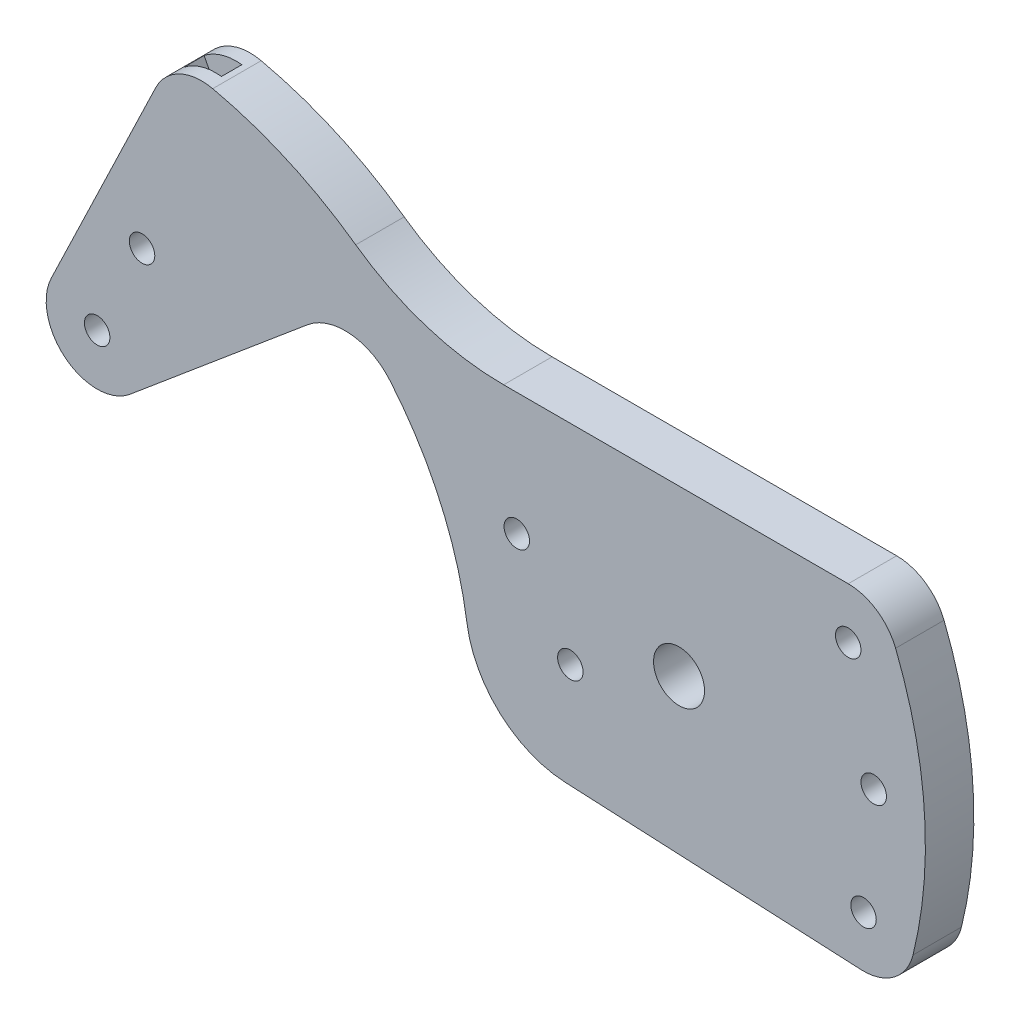
ISO-10303-21;
HEADER;
FILE_DESCRIPTION(('STEP AP214'),'2;1');
FILE_NAME('part.step','',(''),(''),'','','');
FILE_SCHEMA(('AUTOMOTIVE_DESIGN { 1 0 10303 214 1 1 1 1 }'));
ENDSEC;
DATA;
#1=APPLICATION_CONTEXT('core data for automotive mechanical design processes');
#2=APPLICATION_PROTOCOL_DEFINITION('international standard','automotive_design',2000,#1);
#3=PRODUCT_CONTEXT('',#1,'mechanical');
#4=PRODUCT('Part','Part','',(#3));
#5=PRODUCT_RELATED_PRODUCT_CATEGORY('part','',(#4));
#6=PRODUCT_DEFINITION_FORMATION('','',#4);
#7=PRODUCT_DEFINITION_CONTEXT('part definition',#1,'design');
#8=PRODUCT_DEFINITION('design','',#6,#7);
#9=PRODUCT_DEFINITION_SHAPE('','',#8);
#10=(LENGTH_UNIT() NAMED_UNIT(*) SI_UNIT(.MILLI.,.METRE.));
#11=(NAMED_UNIT(*) PLANE_ANGLE_UNIT() SI_UNIT($,.RADIAN.));
#12=(NAMED_UNIT(*) SI_UNIT($,.STERADIAN.) SOLID_ANGLE_UNIT());
#13=UNCERTAINTY_MEASURE_WITH_UNIT(LENGTH_MEASURE(1.E-05),#10,'distance_accuracy_value','');
#14=(GEOMETRIC_REPRESENTATION_CONTEXT(3) GLOBAL_UNCERTAINTY_ASSIGNED_CONTEXT((#13)) GLOBAL_UNIT_ASSIGNED_CONTEXT((#10,
#11,#12)) REPRESENTATION_CONTEXT('',''));
#15=CARTESIAN_POINT('',(0.,0.,0.));
#16=DIRECTION('',(0.,0.,1.));
#17=DIRECTION('',(1.,0.,0.));
#18=AXIS2_PLACEMENT_3D('',#15,#16,#17);
#19=CARTESIAN_POINT('',(-93.6271419122202,44.3112180216615,4.75));
#20=DIRECTION('',(0.,0.,-1.));
#21=DIRECTION('',(-1.,0.,0.));
#22=AXIS2_PLACEMENT_3D('',#19,#20,#21);
#23=CYLINDRICAL_SURFACE('',#22,9.99999999999999);
#24=CARTESIAN_POINT('',(-93.6271419122202,44.3112180216615,-4.75));
#25=DIRECTION('',(0.,0.,1.));
#26=DIRECTION('',(1.,0.,0.));
#27=AXIS2_PLACEMENT_3D('',#24,#25,#26);
#28=CIRCLE('',#27,9.99999999999999);
#29=CARTESIAN_POINT('',(-91.4485216964092,54.0710138164135,-4.75));
#30=VERTEX_POINT('',#29);
#31=CARTESIAN_POINT('',(-102.639296293273,48.6449316038071,-4.75));
#32=VERTEX_POINT('',#31);
#33=EDGE_CURVE('E289',#30,#32,#28,.T.);
#34=ORIENTED_EDGE('',*,*,#33,.T.);
#35=DIRECTION('',(0.,0.,-1.));
#36=VECTOR('',#35,1.);
#37=CARTESIAN_POINT('',(-102.639296293273,48.6449316038071,4.75));
#38=LINE('',#37,#36);
#39=CARTESIAN_POINT('',(-102.639296293273,48.6449316038071,4.75));
#40=VERTEX_POINT('',#39);
#41=EDGE_CURVE('E369',#40,#32,#38,.T.);
#42=ORIENTED_EDGE('',*,*,#41,.F.);
#43=CARTESIAN_POINT('',(-93.6271419122202,44.3112180216615,4.75));
#44=DIRECTION('',(0.,0.,1.));
#45=DIRECTION('',(1.,0.,0.));
#46=AXIS2_PLACEMENT_3D('',#43,#44,#45);
#47=CIRCLE('',#46,9.99999999999999);
#48=CARTESIAN_POINT('',(-91.4485216964092,54.0710138164135,4.75));
#49=VERTEX_POINT('',#48);
#50=EDGE_CURVE('E231',#49,#40,#47,.T.);
#51=ORIENTED_EDGE('',*,*,#50,.F.);
#52=DIRECTION('',(0.,0.,-1.));
#53=VECTOR('',#52,1.);
#54=CARTESIAN_POINT('',(-91.4485216964092,54.0710138164135,4.75));
#55=LINE('',#54,#53);
#56=EDGE_CURVE('E43',#49,#30,#55,.T.);
#57=ORIENTED_EDGE('',*,*,#56,.T.);
#58=EDGE_LOOP('',(#34,#42,#51,#57));
#59=FACE_BOUND('',#58,.T.);
#60=CARTESIAN_POINT('',(-93.6271419122202,44.3112180216615,-2.));
#61=DIRECTION('',(0.,0.,1.));
#62=DIRECTION('',(1.,0.,0.));
#63=AXIS2_PLACEMENT_3D('',#60,#61,#62);
#64=CIRCLE('',#63,10.);
#65=CARTESIAN_POINT('',(-92.4866613894352,54.2459703677016,-2.));
#66=VERTEX_POINT('',#65);
#67=CARTESIAN_POINT('',(-99.8894273287539,52.1076134299171,-2.));
#68=VERTEX_POINT('',#67);
#69=EDGE_CURVE('E189',#66,#68,#64,.T.);
#70=ORIENTED_EDGE('',*,*,#69,.F.);
#71=DIRECTION('',(0.,0.,1.));
#72=VECTOR('',#71,1.);
#73=CARTESIAN_POINT('',(-92.4866613894352,54.2459703677016,-2.));
#74=LINE('',#73,#72);
#75=CARTESIAN_POINT('',(-92.4866613894352,54.2459703677016,2.));
#76=VERTEX_POINT('',#75);
#77=EDGE_CURVE('E172',#66,#76,#74,.T.);
#78=ORIENTED_EDGE('',*,*,#77,.T.);
#79=CARTESIAN_POINT('',(-93.6271419122202,44.3112180216615,2.));
#80=DIRECTION('',(0.,0.,1.));
#81=DIRECTION('',(1.,0.,0.));
#82=AXIS2_PLACEMENT_3D('',#79,#80,#81);
#83=CIRCLE('',#82,10.);
#84=CARTESIAN_POINT('',(-99.8894273287539,52.1076134299171,2.));
#85=VERTEX_POINT('',#84);
#86=EDGE_CURVE('E204',#76,#85,#83,.T.);
#87=ORIENTED_EDGE('',*,*,#86,.T.);
#88=DIRECTION('',(0.,0.,1.));
#89=VECTOR('',#88,1.);
#90=CARTESIAN_POINT('',(-99.8894273287539,52.1076134299171,-2.));
#91=LINE('',#90,#89);
#92=EDGE_CURVE('E182',#68,#85,#91,.T.);
#93=ORIENTED_EDGE('',*,*,#92,.F.);
#94=EDGE_LOOP('',(#70,#78,#87,#93));
#95=FACE_BOUND('',#94,.T.);
#96=ADVANCED_FACE('F35',(#59,#95),#23,.T.);
#97=CARTESIAN_POINT('',(-41.5599291638824,49.5291948890183,4.75));
#98=DIRECTION('',(-0.642787609686535,0.766044443118982,0.));
#99=DIRECTION('',(-0.766044443118982,-0.642787609686535,0.));
#100=AXIS2_PLACEMENT_3D('',#97,#98,#99);
#101=PLANE('',#100);
#102=DIRECTION('',(0.766044443118982,0.642787609686535,0.));
#103=VECTOR('',#102,1.);
#104=CARTESIAN_POINT('',(-41.5599291638824,49.5291948890183,-4.75));
#105=LINE('',#104,#103);
#106=CARTESIAN_POINT('',(-107.689906175498,-5.96044443118984,-4.75));
#107=VERTEX_POINT('',#106);
#108=CARTESIAN_POINT('',(-72.8648183450266,23.2612739230748,-4.75));
#109=VERTEX_POINT('',#108);
#110=EDGE_CURVE('E297',#107,#109,#105,.T.);
#111=ORIENTED_EDGE('',*,*,#110,.T.);
#112=DIRECTION('',(0.,0.,-1.));
#113=VECTOR('',#112,1.);
#114=CARTESIAN_POINT('',(-72.8648183450266,23.2612739230748,4.75));
#115=LINE('',#114,#113);
#116=CARTESIAN_POINT('',(-72.8648183450266,23.2612739230748,4.75));
#117=VERTEX_POINT('',#116);
#118=EDGE_CURVE('E362',#117,#109,#115,.T.);
#119=ORIENTED_EDGE('',*,*,#118,.F.);
#120=DIRECTION('',(0.766044443118982,0.642787609686535,0.));
#121=VECTOR('',#120,1.);
#122=CARTESIAN_POINT('',(-41.5599291638824,49.5291948890183,4.75));
#123=LINE('',#122,#121);
#124=CARTESIAN_POINT('',(-107.689906175498,-5.96044443118984,4.75));
#125=VERTEX_POINT('',#124);
#126=EDGE_CURVE('E238',#125,#117,#123,.T.);
#127=ORIENTED_EDGE('',*,*,#126,.F.);
#128=DIRECTION('',(0.,0.,-1.));
#129=VECTOR('',#128,1.);
#130=CARTESIAN_POINT('',(-107.689906175498,-5.96044443118984,4.75));
#131=LINE('',#130,#129);
#132=EDGE_CURVE('E364',#125,#107,#131,.T.);
#133=ORIENTED_EDGE('',*,*,#132,.T.);
#134=EDGE_LOOP('',(#111,#119,#127,#133));
#135=FACE_BOUND('',#134,.T.);
#136=DIRECTION('',(0.766044443118982,0.642787609686534,0.));
#137=VECTOR('',#136,1.);
#138=CARTESIAN_POINT('',(-41.5599291638823,49.5291948890183,-2.));
#139=LINE('',#138,#137);
#140=CARTESIAN_POINT('',(-92.3690173131185,6.89530776254084,-2.));
#141=VERTEX_POINT('',#140);
#142=CARTESIAN_POINT('',(-78.2271294468595,18.7617606552691,-2.));
#143=VERTEX_POINT('',#142);
#144=EDGE_CURVE('E200',#141,#143,#139,.T.);
#145=ORIENTED_EDGE('',*,*,#144,.F.);
#146=DIRECTION('',(0.,0.,1.));
#147=VECTOR('',#146,1.);
#148=CARTESIAN_POINT('',(-92.3690173131185,6.89530776254084,-2.));
#149=LINE('',#148,#147);
#150=CARTESIAN_POINT('',(-92.3690173131185,6.89530776254084,2.));
#151=VERTEX_POINT('',#150);
#152=EDGE_CURVE('E219',#141,#151,#149,.T.);
#153=ORIENTED_EDGE('',*,*,#152,.T.);
#154=DIRECTION('',(0.766044443118982,0.642787609686534,0.));
#155=VECTOR('',#154,1.);
#156=CARTESIAN_POINT('',(-41.5599291638823,49.5291948890183,2.));
#157=LINE('',#156,#155);
#158=CARTESIAN_POINT('',(-78.2271294468595,18.7617606552691,2.));
#159=VERTEX_POINT('',#158);
#160=EDGE_CURVE('E210',#151,#159,#157,.T.);
#161=ORIENTED_EDGE('',*,*,#160,.T.);
#162=DIRECTION('',(0.,0.,1.));
#163=VECTOR('',#162,1.);
#164=CARTESIAN_POINT('',(-78.2271294468595,18.7617606552691,-2.));
#165=LINE('',#164,#163);
#166=EDGE_CURVE('E217',#143,#159,#165,.T.);
#167=ORIENTED_EDGE('',*,*,#166,.F.);
#168=EDGE_LOOP('',(#145,#153,#161,#167));
#169=FACE_BOUND('',#168,.T.);
#170=ADVANCED_FACE('F434',(#135,#169),#101,.F.);
#171=CARTESIAN_POINT('',(-34.3975290849493,82.3,4.75));
#172=DIRECTION('',(0.,0.,-1.));
#173=DIRECTION('',(-1.,0.,0.));
#174=AXIS2_PLACEMENT_3D('',#171,#172,#173);
#175=CYLINDRICAL_SURFACE('',#174,50.);
#176=CARTESIAN_POINT('',(-34.3975290849493,82.3,-4.75));
#177=DIRECTION('',(0.,0.,1.));
#178=DIRECTION('',(1.,0.,0.));
#179=AXIS2_PLACEMENT_3D('',#176,#177,#178);
#180=CIRCLE('',#179,50.);
#181=CARTESIAN_POINT('',(-63.4015741934302,41.572056676709,-4.75));
#182=VERTEX_POINT('',#181);
#183=CARTESIAN_POINT('',(-34.3975290849493,32.3,-4.75));
#184=VERTEX_POINT('',#183);
#185=EDGE_CURVE('E216',#182,#184,#180,.T.);
#186=ORIENTED_EDGE('',*,*,#185,.F.);
#187=DIRECTION('',(0.,0.,-1.));
#188=VECTOR('',#187,1.);
#189=CARTESIAN_POINT('',(-63.4015741934302,41.572056676709,4.75));
#190=LINE('',#189,#188);
#191=CARTESIAN_POINT('',(-63.4015741934302,41.572056676709,4.75));
#192=VERTEX_POINT('',#191);
#193=EDGE_CURVE('E11',#192,#182,#190,.T.);
#194=ORIENTED_EDGE('',*,*,#193,.F.);
#195=CARTESIAN_POINT('',(-34.3975290849493,82.3,4.75));
#196=DIRECTION('',(0.,0.,1.));
#197=DIRECTION('',(1.,0.,0.));
#198=AXIS2_PLACEMENT_3D('',#195,#196,#197);
#199=CIRCLE('',#198,50.);
#200=CARTESIAN_POINT('',(-34.3975290849493,32.3,4.75));
#201=VERTEX_POINT('',#200);
#202=EDGE_CURVE('E225',#192,#201,#199,.T.);
#203=ORIENTED_EDGE('',*,*,#202,.T.);
#204=DIRECTION('',(0.,0.,-1.));
#205=VECTOR('',#204,1.);
#206=CARTESIAN_POINT('',(-34.3975290849493,32.3,4.75));
#207=LINE('',#206,#205);
#208=EDGE_CURVE('E284',#201,#184,#207,.T.);
#209=ORIENTED_EDGE('',*,*,#208,.T.);
#210=EDGE_LOOP('',(#186,#194,#203,#209));
#211=FACE_BOUND('',#210,.T.);
#212=ADVANCED_FACE('F37',(#211),#175,.F.);
#213=CARTESIAN_POINT('',(-108.317782272363,-21.5,4.75));
#214=DIRECTION('',(0.,0.,-1.));
#215=DIRECTION('',(-1.,0.,0.));
#216=AXIS2_PLACEMENT_3D('',#213,#214,#215);
#217=CYLINDRICAL_SURFACE('',#216,77.4309374967139);
#218=CARTESIAN_POINT('',(-108.317782272363,-21.5,-4.75));
#219=DIRECTION('',(0.,0.,1.));
#220=DIRECTION('',(1.,0.,0.));
#221=AXIS2_PLACEMENT_3D('',#218,#219,#220);
#222=CIRCLE('',#221,77.4309374967139);
#223=EDGE_CURVE('E287',#182,#30,#222,.T.);
#224=ORIENTED_EDGE('',*,*,#223,.T.);
#225=ORIENTED_EDGE('',*,*,#56,.F.);
#226=CARTESIAN_POINT('',(-108.317782272363,-21.5,4.75));
#227=DIRECTION('',(0.,0.,1.));
#228=DIRECTION('',(1.,0.,0.));
#229=AXIS2_PLACEMENT_3D('',#226,#227,#228);
#230=CIRCLE('',#229,77.4309374967139);
#231=EDGE_CURVE('E228',#192,#49,#230,.T.);
#232=ORIENTED_EDGE('',*,*,#231,.F.);
#233=ORIENTED_EDGE('',*,*,#193,.T.);
#234=EDGE_LOOP('',(#224,#225,#232,#233));
#235=FACE_BOUND('',#234,.T.);
#236=ADVANCED_FACE('F396',(#235),#217,.T.);
#237=CARTESIAN_POINT('',(-102.361345817989,49.2229422512733,4.75));
#238=DIRECTION('',(-0.901215438105268,0.433371358214556,0.));
#239=DIRECTION('',(-0.433371358214556,-0.901215438105268,0.));
#240=AXIS2_PLACEMENT_3D('',#237,#238,#239);
#241=PLANE('',#240);
#242=DIRECTION('',(0.433371358214557,0.901215438105268,0.));
#243=VECTOR('',#242,1.);
#244=CARTESIAN_POINT('',(-102.361345817989,49.2229422512733,-4.75));
#245=LINE('',#244,#243);
#246=CARTESIAN_POINT('',(-123.129936653416,6.03371358214555,-4.75));
#247=VERTEX_POINT('',#246);
#248=EDGE_CURVE('E292',#247,#32,#245,.T.);
#249=ORIENTED_EDGE('',*,*,#248,.F.);
#250=DIRECTION('',(0.,0.,-1.));
#251=VECTOR('',#250,1.);
#252=CARTESIAN_POINT('',(-123.129936653416,6.03371358214555,4.75));
#253=LINE('',#252,#251);
#254=CARTESIAN_POINT('',(-123.129936653416,6.03371358214555,4.75));
#255=VERTEX_POINT('',#254);
#256=EDGE_CURVE('E367',#255,#247,#253,.T.);
#257=ORIENTED_EDGE('',*,*,#256,.F.);
#258=DIRECTION('',(0.433371358214557,0.901215438105268,0.));
#259=VECTOR('',#258,1.);
#260=CARTESIAN_POINT('',(-102.361345817989,49.2229422512733,4.75));
#261=LINE('',#260,#259);
#262=EDGE_CURVE('E233',#255,#40,#261,.T.);
#263=ORIENTED_EDGE('',*,*,#262,.T.);
#264=ORIENTED_EDGE('',*,*,#41,.T.);
#265=EDGE_LOOP('',(#249,#257,#263,#264));
#266=FACE_BOUND('',#265,.T.);
#267=ADVANCED_FACE('F387',(#266),#241,.T.);
#268=CARTESIAN_POINT('',(-114.117782272363,1.69999999999999,4.75));
#269=DIRECTION('',(0.,0.,-1.));
#270=DIRECTION('',(-1.,0.,0.));
#271=AXIS2_PLACEMENT_3D('',#268,#269,#270);
#272=CYLINDRICAL_SURFACE('',#271,10.);
#273=CARTESIAN_POINT('',(-114.117782272363,1.69999999999999,-4.75));
#274=DIRECTION('',(0.,0.,1.));
#275=DIRECTION('',(1.,0.,0.));
#276=AXIS2_PLACEMENT_3D('',#273,#274,#275);
#277=CIRCLE('',#276,10.);
#278=EDGE_CURVE('E295',#247,#107,#277,.T.);
#279=ORIENTED_EDGE('',*,*,#278,.T.);
#280=ORIENTED_EDGE('',*,*,#132,.F.);
#281=CARTESIAN_POINT('',(-114.117782272363,1.69999999999999,4.75));
#282=DIRECTION('',(0.,0.,1.));
#283=DIRECTION('',(1.,0.,0.));
#284=AXIS2_PLACEMENT_3D('',#281,#282,#283);
#285=CIRCLE('',#284,10.);
#286=EDGE_CURVE('E236',#255,#125,#285,.T.);
#287=ORIENTED_EDGE('',*,*,#286,.F.);
#288=ORIENTED_EDGE('',*,*,#256,.T.);
#289=EDGE_LOOP('',(#279,#280,#287,#288));
#290=FACE_BOUND('',#289,.T.);
#291=ADVANCED_FACE('F438',(#290),#272,.T.);
#292=CARTESIAN_POINT('',(-65.4725042221845,14.4514570095927,4.75));
#293=DIRECTION('',(0.,0.,-1.));
#294=DIRECTION('',(-1.,0.,0.));
#295=AXIS2_PLACEMENT_3D('',#292,#293,#294);
#296=CYLINDRICAL_SURFACE('',#295,11.5003992165423);
#297=CARTESIAN_POINT('',(-65.4725042221845,14.4514570095927,-4.75));
#298=DIRECTION('',(0.,0.,1.));
#299=DIRECTION('',(1.,0.,0.));
#300=AXIS2_PLACEMENT_3D('',#297,#298,#299);
#301=CIRCLE('',#300,11.5003992165423);
#302=CARTESIAN_POINT('',(-56.6626873087024,21.8437711324349,-4.75));
#303=VERTEX_POINT('',#302);
#304=EDGE_CURVE('E300',#303,#109,#301,.T.);
#305=ORIENTED_EDGE('',*,*,#304,.F.);
#306=DIRECTION('',(0.,0.,-1.));
#307=VECTOR('',#306,1.);
#308=CARTESIAN_POINT('',(-56.6626873087024,21.8437711324349,4.75));
#309=LINE('',#308,#307);
#310=CARTESIAN_POINT('',(-56.6626873087024,21.8437711324349,4.75));
#311=VERTEX_POINT('',#310);
#312=EDGE_CURVE('E360',#311,#303,#309,.T.);
#313=ORIENTED_EDGE('',*,*,#312,.F.);
#314=CARTESIAN_POINT('',(-65.4725042221845,14.4514570095927,4.75));
#315=DIRECTION('',(0.,0.,1.));
#316=DIRECTION('',(1.,0.,0.));
#317=AXIS2_PLACEMENT_3D('',#314,#315,#316);
#318=CIRCLE('',#317,11.5003992165423);
#319=EDGE_CURVE('E240',#311,#117,#318,.T.);
#320=ORIENTED_EDGE('',*,*,#319,.T.);
#321=ORIENTED_EDGE('',*,*,#118,.T.);
#322=EDGE_LOOP('',(#305,#313,#320,#321));
#323=FACE_BOUND('',#322,.T.);
#324=ADVANCED_FACE('F431',(#323),#296,.F.);
#325=CARTESIAN_POINT('',(-108.317782272363,-21.5,4.75));
#326=DIRECTION('',(0.,0.,-1.));
#327=DIRECTION('',(-1.,0.,0.));
#328=AXIS2_PLACEMENT_3D('',#325,#326,#327);
#329=CYLINDRICAL_SURFACE('',#328,67.4309374967139);
#330=CARTESIAN_POINT('',(-108.317782272363,-21.5,-4.75));
#331=DIRECTION('',(0.,0.,1.));
#332=DIRECTION('',(1.,0.,0.));
#333=AXIS2_PLACEMENT_3D('',#330,#331,#332);
#334=CIRCLE('',#333,67.4309374967139);
#335=CARTESIAN_POINT('',(-41.6050176914802,-11.6847886593643,-4.75));
#336=VERTEX_POINT('',#335);
#337=EDGE_CURVE('E303',#336,#303,#334,.T.);
#338=ORIENTED_EDGE('',*,*,#337,.F.);
#339=DIRECTION('',(0.,0.,-1.));
#340=VECTOR('',#339,1.);
#341=CARTESIAN_POINT('',(-41.6050176914802,-11.6847886593643,4.75));
#342=LINE('',#341,#340);
#343=CARTESIAN_POINT('',(-41.6050176914802,-11.6847886593643,4.75));
#344=VERTEX_POINT('',#343);
#345=EDGE_CURVE('E358',#344,#336,#342,.T.);
#346=ORIENTED_EDGE('',*,*,#345,.F.);
#347=CARTESIAN_POINT('',(-108.317782272363,-21.5,4.75));
#348=DIRECTION('',(0.,0.,1.));
#349=DIRECTION('',(1.,0.,0.));
#350=AXIS2_PLACEMENT_3D('',#347,#348,#349);
#351=CIRCLE('',#350,67.4309374967139);
#352=EDGE_CURVE('E243',#344,#311,#351,.T.);
#353=ORIENTED_EDGE('',*,*,#352,.T.);
#354=ORIENTED_EDGE('',*,*,#312,.T.);
#355=EDGE_LOOP('',(#338,#346,#353,#354));
#356=FACE_BOUND('',#355,.T.);
#357=ADVANCED_FACE('F425',(#356),#329,.F.);
#358=CARTESIAN_POINT('',(-21.3177822723635,-8.70000000000001,4.75));
#359=DIRECTION('',(0.,0.,-1.));
#360=DIRECTION('',(-1.,0.,0.));
#361=AXIS2_PLACEMENT_3D('',#358,#359,#360);
#362=CYLINDRICAL_SURFACE('',#361,20.5056305509422);
#363=CARTESIAN_POINT('',(-21.3177822723635,-8.70000000000001,-4.75));
#364=DIRECTION('',(0.,0.,1.));
#365=DIRECTION('',(1.,0.,0.));
#366=AXIS2_PLACEMENT_3D('',#363,#364,#365);
#367=CIRCLE('',#366,20.5056305509422);
#368=CARTESIAN_POINT('',(-22.3087673324672,-29.1816706570142,-4.75));
#369=VERTEX_POINT('',#368);
#370=EDGE_CURVE('E306',#336,#369,#367,.T.);
#371=ORIENTED_EDGE('',*,*,#370,.T.);
#372=DIRECTION('',(0.,0.,-1.));
#373=VECTOR('',#372,1.);
#374=CARTESIAN_POINT('',(-22.3087673324672,-29.1816706570142,4.75));
#375=LINE('',#374,#373);
#376=CARTESIAN_POINT('',(-22.3087673324672,-29.1816706570142,4.75));
#377=VERTEX_POINT('',#376);
#378=EDGE_CURVE('E356',#377,#369,#375,.T.);
#379=ORIENTED_EDGE('',*,*,#378,.F.);
#380=CARTESIAN_POINT('',(-21.3177822723635,-8.70000000000001,4.75));
#381=DIRECTION('',(0.,0.,1.));
#382=DIRECTION('',(1.,0.,0.));
#383=AXIS2_PLACEMENT_3D('',#380,#381,#382);
#384=CIRCLE('',#383,20.5056305509422);
#385=EDGE_CURVE('E246',#344,#377,#384,.T.);
#386=ORIENTED_EDGE('',*,*,#385,.F.);
#387=ORIENTED_EDGE('',*,*,#345,.T.);
#388=EDGE_LOOP('',(#371,#379,#386,#387));
#389=FACE_BOUND('',#388,.T.);
#390=ADVANCED_FACE('F573',(#389),#362,.T.);
#391=CARTESIAN_POINT('',(-1.46073130263893,-30.1903819376533,4.75));
#392=DIRECTION('',(-0.0483274609694089,-0.998831545615301,0.));
#393=DIRECTION('',(0.998831545615301,-0.0483274609694089,0.));
#394=AXIS2_PLACEMENT_3D('',#391,#392,#393);
#395=PLANE('',#394);
#396=DIRECTION('',(-0.998831545615301,0.0483274609694089,0.));
#397=VECTOR('',#396,1.);
#398=CARTESIAN_POINT('',(-1.46073130263893,-30.1903819376533,-4.75));
#399=LINE('',#398,#397);
#400=CARTESIAN_POINT('',(35.6989431179424,-31.988315456153,-4.75));
#401=VERTEX_POINT('',#400);
#402=EDGE_CURVE('E309',#401,#369,#399,.T.);
#403=ORIENTED_EDGE('',*,*,#402,.F.);
#404=DIRECTION('',(0.,0.,-1.));
#405=VECTOR('',#404,1.);
#406=CARTESIAN_POINT('',(35.6989431179424,-31.988315456153,4.75));
#407=LINE('',#406,#405);
#408=CARTESIAN_POINT('',(35.6989431179424,-31.988315456153,4.75));
#409=VERTEX_POINT('',#408);
#410=EDGE_CURVE('E354',#409,#401,#407,.T.);
#411=ORIENTED_EDGE('',*,*,#410,.F.);
#412=DIRECTION('',(-0.998831545615301,0.0483274609694089,0.));
#413=VECTOR('',#412,1.);
#414=CARTESIAN_POINT('',(-1.46073130263893,-30.1903819376533,4.75));
#415=LINE('',#414,#413);
#416=EDGE_CURVE('E248',#409,#377,#415,.T.);
#417=ORIENTED_EDGE('',*,*,#416,.T.);
#418=ORIENTED_EDGE('',*,*,#378,.T.);
#419=EDGE_LOOP('',(#403,#411,#417,#418));
#420=FACE_BOUND('',#419,.T.);
#421=ADVANCED_FACE('F419',(#420),#395,.T.);
#422=CARTESIAN_POINT('',(36.1822177276365,-22.,4.75));
#423=DIRECTION('',(0.,0.,-1.));
#424=DIRECTION('',(-1.,0.,0.));
#425=AXIS2_PLACEMENT_3D('',#422,#423,#424);
#426=CYLINDRICAL_SURFACE('',#425,9.99999999999999);
#427=CARTESIAN_POINT('',(36.1822177276365,-22.,-4.75));
#428=DIRECTION('',(0.,0.,1.));
#429=DIRECTION('',(1.,0.,0.));
#430=AXIS2_PLACEMENT_3D('',#427,#428,#429);
#431=CIRCLE('',#430,9.99999999999999);
#432=CARTESIAN_POINT('',(45.8882570065409,-24.4068239479377,-4.75));
#433=VERTEX_POINT('',#432);
#434=EDGE_CURVE('E312',#401,#433,#431,.T.);
#435=ORIENTED_EDGE('',*,*,#434,.T.);
#436=DIRECTION('',(0.,0.,-1.));
#437=VECTOR('',#436,1.);
#438=CARTESIAN_POINT('',(45.8882570065409,-24.4068239479377,4.75));
#439=LINE('',#438,#437);
#440=CARTESIAN_POINT('',(45.8882570065409,-24.4068239479377,4.75));
#441=VERTEX_POINT('',#440);
#442=EDGE_CURVE('E351',#441,#433,#439,.T.);
#443=ORIENTED_EDGE('',*,*,#442,.F.);
#444=CARTESIAN_POINT('',(36.1822177276365,-22.,4.75));
#445=DIRECTION('',(0.,0.,1.));
#446=DIRECTION('',(1.,0.,0.));
#447=AXIS2_PLACEMENT_3D('',#444,#445,#446);
#448=CIRCLE('',#447,9.99999999999999);
#449=EDGE_CURVE('E251',#409,#441,#448,.T.);
#450=ORIENTED_EDGE('',*,*,#449,.F.);
#451=ORIENTED_EDGE('',*,*,#410,.T.);
#452=EDGE_LOOP('',(#435,#443,#450,#451));
#453=FACE_BOUND('',#452,.T.);
#454=ADVANCED_FACE('F416',(#453),#426,.T.);
#455=CARTESIAN_POINT('',(-34.3029021686694,-4.52167854828258,4.75));
#456=DIRECTION('',(0.,0.,-1.));
#457=DIRECTION('',(-1.,0.,0.));
#458=AXIS2_PLACEMENT_3D('',#455,#456,#457);
#459=CYLINDRICAL_SURFACE('',#458,82.6198584931573);
#460=CARTESIAN_POINT('',(-34.3029021686694,-4.52167854828258,-4.75));
#461=DIRECTION('',(0.,0.,1.));
#462=DIRECTION('',(1.,0.,0.));
#463=AXIS2_PLACEMENT_3D('',#460,#461,#462);
#464=CIRCLE('',#463,82.6198584931573);
#465=CARTESIAN_POINT('',(42.4751468652863,25.9934358045892,-4.75));
#466=VERTEX_POINT('',#465);
#467=EDGE_CURVE('E314',#433,#466,#464,.T.);
#468=ORIENTED_EDGE('',*,*,#467,.T.);
#469=DIRECTION('',(0.,0.,-1.));
#470=VECTOR('',#469,1.);
#471=CARTESIAN_POINT('',(42.4751468652863,25.9934358045892,4.75));
#472=LINE('',#471,#470);
#473=CARTESIAN_POINT('',(42.4751468652863,25.9934358045892,4.75));
#474=VERTEX_POINT('',#473);
#475=EDGE_CURVE('E348',#474,#466,#472,.T.);
#476=ORIENTED_EDGE('',*,*,#475,.F.);
#477=CARTESIAN_POINT('',(-34.3029021686694,-4.52167854828258,4.75));
#478=DIRECTION('',(0.,0.,1.));
#479=DIRECTION('',(1.,0.,0.));
#480=AXIS2_PLACEMENT_3D('',#477,#478,#479);
#481=CIRCLE('',#480,82.6198584931573);
#482=EDGE_CURVE('E253',#441,#474,#481,.T.);
#483=ORIENTED_EDGE('',*,*,#482,.F.);
#484=ORIENTED_EDGE('',*,*,#442,.T.);
#485=EDGE_LOOP('',(#468,#476,#483,#484));
#486=FACE_BOUND('',#485,.T.);
#487=ADVANCED_FACE('F411',(#486),#459,.T.);
#488=CARTESIAN_POINT('',(33.1822177276365,22.3,4.75));
#489=DIRECTION('',(0.,0.,-1.));
#490=DIRECTION('',(-1.,0.,0.));
#491=AXIS2_PLACEMENT_3D('',#488,#489,#490);
#492=CYLINDRICAL_SURFACE('',#491,10.);
#493=CARTESIAN_POINT('',(33.1822177276365,22.3,-4.75));
#494=DIRECTION('',(0.,0.,1.));
#495=DIRECTION('',(1.,0.,0.));
#496=AXIS2_PLACEMENT_3D('',#493,#494,#495);
#497=CIRCLE('',#496,10.);
#498=CARTESIAN_POINT('',(33.1822177276365,32.3,-4.75));
#499=VERTEX_POINT('',#498);
#500=EDGE_CURVE('E316',#466,#499,#497,.T.);
#501=ORIENTED_EDGE('',*,*,#500,.T.);
#502=DIRECTION('',(0.,0.,-1.));
#503=VECTOR('',#502,1.);
#504=CARTESIAN_POINT('',(33.1822177276365,32.3,4.75));
#505=LINE('',#504,#503);
#506=CARTESIAN_POINT('',(33.1822177276365,32.3,4.75));
#507=VERTEX_POINT('',#506);
#508=EDGE_CURVE('E346',#507,#499,#505,.T.);
#509=ORIENTED_EDGE('',*,*,#508,.F.);
#510=CARTESIAN_POINT('',(33.1822177276365,22.3,4.75));
#511=DIRECTION('',(0.,0.,1.));
#512=DIRECTION('',(1.,0.,0.));
#513=AXIS2_PLACEMENT_3D('',#510,#511,#512);
#514=CIRCLE('',#513,10.);
#515=EDGE_CURVE('E255',#474,#507,#514,.T.);
#516=ORIENTED_EDGE('',*,*,#515,.F.);
#517=ORIENTED_EDGE('',*,*,#475,.T.);
#518=EDGE_LOOP('',(#501,#509,#516,#517));
#519=FACE_BOUND('',#518,.T.);
#520=ADVANCED_FACE('F405',(#519),#492,.T.);
#521=CARTESIAN_POINT('',(-105.317782272363,20.,4.75));
#522=DIRECTION('',(0.,0.,-1.));
#523=DIRECTION('',(-1.,0.,0.));
#524=AXIS2_PLACEMENT_3D('',#521,#522,#523);
#525=CYLINDRICAL_SURFACE('',#524,2.50000000000001);
#526=CARTESIAN_POINT('',(-105.317782272363,20.,4.75));
#527=DIRECTION('',(0.,0.,1.));
#528=DIRECTION('',(1.,0.,0.));
#529=AXIS2_PLACEMENT_3D('',#526,#527,#528);
#530=CIRCLE('',#529,2.50000000000001);
#531=CARTESIAN_POINT('',(-102.817782272363,20.,4.75));
#532=VERTEX_POINT('',#531);
#533=EDGE_CURVE('E278',#532,#532,#530,.T.);
#534=ORIENTED_EDGE('',*,*,#533,.T.);
#535=EDGE_LOOP('',(#534));
#536=FACE_BOUND('',#535,.T.);
#537=CARTESIAN_POINT('',(-105.317782272363,20.,-4.75));
#538=DIRECTION('',(0.,0.,1.));
#539=DIRECTION('',(1.,0.,0.));
#540=AXIS2_PLACEMENT_3D('',#537,#538,#539);
#541=CIRCLE('',#540,2.50000000000001);
#542=CARTESIAN_POINT('',(-102.817782272363,20.,-4.75));
#543=VERTEX_POINT('',#542);
#544=EDGE_CURVE('E340',#543,#543,#541,.T.);
#545=ORIENTED_EDGE('',*,*,#544,.F.);
#546=EDGE_LOOP('',(#545));
#547=FACE_BOUND('',#546,.T.);
#548=ADVANCED_FACE('F535',(#536,#547),#525,.F.);
#549=CARTESIAN_POINT('',(0.,0.,4.75));
#550=DIRECTION('',(0.,0.,-1.));
#551=DIRECTION('',(-1.,0.,0.));
#552=AXIS2_PLACEMENT_3D('',#549,#550,#551);
#553=CYLINDRICAL_SURFACE('',#552,5.);
#554=CARTESIAN_POINT('',(0.,0.,4.75));
#555=DIRECTION('',(0.,0.,1.));
#556=DIRECTION('',(1.,0.,0.));
#557=AXIS2_PLACEMENT_3D('',#554,#555,#556);
#558=CIRCLE('',#557,5.);
#559=CARTESIAN_POINT('',(5.,0.,4.75));
#560=VERTEX_POINT('',#559);
#561=EDGE_CURVE('E275',#560,#560,#558,.T.);
#562=ORIENTED_EDGE('',*,*,#561,.T.);
#563=EDGE_LOOP('',(#562));
#564=FACE_BOUND('',#563,.T.);
#565=CARTESIAN_POINT('',(0.,0.,-4.75));
#566=DIRECTION('',(0.,0.,1.));
#567=DIRECTION('',(1.,0.,0.));
#568=AXIS2_PLACEMENT_3D('',#565,#566,#567);
#569=CIRCLE('',#568,5.);
#570=CARTESIAN_POINT('',(5.,0.,-4.75));
#571=VERTEX_POINT('',#570);
#572=EDGE_CURVE('E337',#571,#571,#569,.T.);
#573=ORIENTED_EDGE('',*,*,#572,.F.);
#574=EDGE_LOOP('',(#573));
#575=FACE_BOUND('',#574,.T.);
#576=ADVANCED_FACE('F538',(#564,#575),#553,.F.);
#577=CARTESIAN_POINT('',(-31.8177822723635,8.3,4.75));
#578=DIRECTION('',(0.,0.,-1.));
#579=DIRECTION('',(-1.,0.,0.));
#580=AXIS2_PLACEMENT_3D('',#577,#578,#579);
#581=CYLINDRICAL_SURFACE('',#580,2.5);
#582=CARTESIAN_POINT('',(-31.8177822723635,8.3,4.75));
#583=DIRECTION('',(0.,0.,1.));
#584=DIRECTION('',(1.,0.,0.));
#585=AXIS2_PLACEMENT_3D('',#582,#583,#584);
#586=CIRCLE('',#585,2.5);
#587=CARTESIAN_POINT('',(-29.3177822723635,8.3,4.75));
#588=VERTEX_POINT('',#587);
#589=EDGE_CURVE('E272',#588,#588,#586,.T.);
#590=ORIENTED_EDGE('',*,*,#589,.T.);
#591=EDGE_LOOP('',(#590));
#592=FACE_BOUND('',#591,.T.);
#593=CARTESIAN_POINT('',(-31.8177822723635,8.3,-4.75));
#594=DIRECTION('',(0.,0.,1.));
#595=DIRECTION('',(1.,0.,0.));
#596=AXIS2_PLACEMENT_3D('',#593,#594,#595);
#597=CIRCLE('',#596,2.5);
#598=CARTESIAN_POINT('',(-29.3177822723635,8.3,-4.75));
#599=VERTEX_POINT('',#598);
#600=EDGE_CURVE('E334',#599,#599,#597,.T.);
#601=ORIENTED_EDGE('',*,*,#600,.F.);
#602=EDGE_LOOP('',(#601));
#603=FACE_BOUND('',#602,.T.);
#604=ADVANCED_FACE('F542',(#592,#603),#581,.F.);
#605=CARTESIAN_POINT('',(-21.3177822723635,-8.70000000000001,4.75));
#606=DIRECTION('',(0.,0.,-1.));
#607=DIRECTION('',(-1.,0.,0.));
#608=AXIS2_PLACEMENT_3D('',#605,#606,#607);
#609=CYLINDRICAL_SURFACE('',#608,2.5);
#610=CARTESIAN_POINT('',(-21.3177822723635,-8.70000000000001,4.75));
#611=DIRECTION('',(0.,0.,1.));
#612=DIRECTION('',(1.,0.,0.));
#613=AXIS2_PLACEMENT_3D('',#610,#611,#612);
#614=CIRCLE('',#613,2.5);
#615=CARTESIAN_POINT('',(-18.8177822723635,-8.70000000000001,4.75));
#616=VERTEX_POINT('',#615);
#617=EDGE_CURVE('E269',#616,#616,#614,.T.);
#618=ORIENTED_EDGE('',*,*,#617,.T.);
#619=EDGE_LOOP('',(#618));
#620=FACE_BOUND('',#619,.T.);
#621=CARTESIAN_POINT('',(-21.3177822723635,-8.70000000000001,-4.75));
#622=DIRECTION('',(0.,0.,1.));
#623=DIRECTION('',(1.,0.,0.));
#624=AXIS2_PLACEMENT_3D('',#621,#622,#623);
#625=CIRCLE('',#624,2.5);
#626=CARTESIAN_POINT('',(-18.8177822723635,-8.70000000000001,-4.75));
#627=VERTEX_POINT('',#626);
#628=EDGE_CURVE('E331',#627,#627,#625,.T.);
#629=ORIENTED_EDGE('',*,*,#628,.F.);
#630=EDGE_LOOP('',(#629));
#631=FACE_BOUND('',#630,.T.);
#632=ADVANCED_FACE('F546',(#620,#631),#609,.F.);
#633=CARTESIAN_POINT('',(33.1822177276365,22.3,4.75));
#634=DIRECTION('',(0.,0.,-1.));
#635=DIRECTION('',(-1.,0.,0.));
#636=AXIS2_PLACEMENT_3D('',#633,#634,#635);
#637=CYLINDRICAL_SURFACE('',#636,2.50000000000002);
#638=CARTESIAN_POINT('',(33.1822177276365,22.3,4.75));
#639=DIRECTION('',(0.,0.,1.));
#640=DIRECTION('',(1.,0.,0.));
#641=AXIS2_PLACEMENT_3D('',#638,#639,#640);
#642=CIRCLE('',#641,2.50000000000002);
#643=CARTESIAN_POINT('',(35.6822177276366,22.3,4.75));
#644=VERTEX_POINT('',#643);
#645=EDGE_CURVE('E266',#644,#644,#642,.T.);
#646=ORIENTED_EDGE('',*,*,#645,.T.);
#647=EDGE_LOOP('',(#646));
#648=FACE_BOUND('',#647,.T.);
#649=CARTESIAN_POINT('',(33.1822177276365,22.3,-4.75));
#650=DIRECTION('',(0.,0.,1.));
#651=DIRECTION('',(1.,0.,0.));
#652=AXIS2_PLACEMENT_3D('',#649,#650,#651);
#653=CIRCLE('',#652,2.50000000000002);
#654=CARTESIAN_POINT('',(35.6822177276366,22.3,-4.75));
#655=VERTEX_POINT('',#654);
#656=EDGE_CURVE('E328',#655,#655,#653,.T.);
#657=ORIENTED_EDGE('',*,*,#656,.F.);
#658=EDGE_LOOP('',(#657));
#659=FACE_BOUND('',#658,.T.);
#660=ADVANCED_FACE('F550',(#648,#659),#637,.F.);
#661=CARTESIAN_POINT('',(38.1822177276366,-0.100000000000012,4.75));
#662=DIRECTION('',(0.,0.,-1.));
#663=DIRECTION('',(-1.,0.,0.));
#664=AXIS2_PLACEMENT_3D('',#661,#662,#663);
#665=CYLINDRICAL_SURFACE('',#664,2.5);
#666=CARTESIAN_POINT('',(38.1822177276366,-0.100000000000012,4.75));
#667=DIRECTION('',(0.,0.,1.));
#668=DIRECTION('',(1.,0.,0.));
#669=AXIS2_PLACEMENT_3D('',#666,#667,#668);
#670=CIRCLE('',#669,2.5);
#671=CARTESIAN_POINT('',(40.6822177276366,-0.100000000000012,4.75));
#672=VERTEX_POINT('',#671);
#673=EDGE_CURVE('E263',#672,#672,#670,.T.);
#674=ORIENTED_EDGE('',*,*,#673,.T.);
#675=EDGE_LOOP('',(#674));
#676=FACE_BOUND('',#675,.T.);
#677=CARTESIAN_POINT('',(38.1822177276366,-0.100000000000012,-4.75));
#678=DIRECTION('',(0.,0.,1.));
#679=DIRECTION('',(1.,0.,0.));
#680=AXIS2_PLACEMENT_3D('',#677,#678,#679);
#681=CIRCLE('',#680,2.5);
#682=CARTESIAN_POINT('',(40.6822177276366,-0.100000000000012,-4.75));
#683=VERTEX_POINT('',#682);
#684=EDGE_CURVE('E325',#683,#683,#681,.T.);
#685=ORIENTED_EDGE('',*,*,#684,.F.);
#686=EDGE_LOOP('',(#685));
#687=FACE_BOUND('',#686,.T.);
#688=ADVANCED_FACE('F554',(#676,#687),#665,.F.);
#689=CARTESIAN_POINT('',(36.1822177276365,-22.,4.75));
#690=DIRECTION('',(0.,0.,-1.));
#691=DIRECTION('',(-1.,0.,0.));
#692=AXIS2_PLACEMENT_3D('',#689,#690,#691);
#693=CYLINDRICAL_SURFACE('',#692,2.5);
#694=CARTESIAN_POINT('',(36.1822177276365,-22.,4.75));
#695=DIRECTION('',(0.,0.,1.));
#696=DIRECTION('',(1.,0.,0.));
#697=AXIS2_PLACEMENT_3D('',#694,#695,#696);
#698=CIRCLE('',#697,2.5);
#699=CARTESIAN_POINT('',(38.6822177276366,-22.,4.75));
#700=VERTEX_POINT('',#699);
#701=EDGE_CURVE('E260',#700,#700,#698,.T.);
#702=ORIENTED_EDGE('',*,*,#701,.T.);
#703=EDGE_LOOP('',(#702));
#704=FACE_BOUND('',#703,.T.);
#705=CARTESIAN_POINT('',(36.1822177276365,-22.,-4.75));
#706=DIRECTION('',(0.,0.,1.));
#707=DIRECTION('',(1.,0.,0.));
#708=AXIS2_PLACEMENT_3D('',#705,#706,#707);
#709=CIRCLE('',#708,2.5);
#710=CARTESIAN_POINT('',(38.6822177276366,-22.,-4.75));
#711=VERTEX_POINT('',#710);
#712=EDGE_CURVE('E322',#711,#711,#709,.T.);
#713=ORIENTED_EDGE('',*,*,#712,.F.);
#714=EDGE_LOOP('',(#713));
#715=FACE_BOUND('',#714,.T.);
#716=ADVANCED_FACE('F558',(#704,#715),#693,.F.);
#717=CARTESIAN_POINT('',(0.,32.3,4.75));
#718=DIRECTION('',(0.,1.,0.));
#719=DIRECTION('',(-1.,0.,0.));
#720=AXIS2_PLACEMENT_3D('',#717,#718,#719);
#721=PLANE('',#720);
#722=DIRECTION('',(1.,0.,0.));
#723=VECTOR('',#722,1.);
#724=CARTESIAN_POINT('',(0.,32.3,-4.75));
#725=LINE('',#724,#723);
#726=EDGE_CURVE('E319',#184,#499,#725,.T.);
#727=ORIENTED_EDGE('',*,*,#726,.F.);
#728=ORIENTED_EDGE('',*,*,#208,.F.);
#729=DIRECTION('',(1.,0.,0.));
#730=VECTOR('',#729,1.);
#731=CARTESIAN_POINT('',(0.,32.3,4.75));
#732=LINE('',#731,#730);
#733=EDGE_CURVE('E257',#201,#507,#732,.T.);
#734=ORIENTED_EDGE('',*,*,#733,.T.);
#735=ORIENTED_EDGE('',*,*,#508,.T.);
#736=EDGE_LOOP('',(#727,#728,#734,#735));
#737=FACE_BOUND('',#736,.T.);
#738=ADVANCED_FACE('F401',(#737),#721,.T.);
#739=CARTESIAN_POINT('',(-114.117782272363,1.69999999999999,4.75));
#740=DIRECTION('',(0.,0.,-1.));
#741=DIRECTION('',(-1.,0.,0.));
#742=AXIS2_PLACEMENT_3D('',#739,#740,#741);
#743=CYLINDRICAL_SURFACE('',#742,2.49999999999999);
#744=CARTESIAN_POINT('',(-114.117782272363,1.69999999999999,4.75));
#745=DIRECTION('',(0.,0.,1.));
#746=DIRECTION('',(1.,0.,0.));
#747=AXIS2_PLACEMENT_3D('',#744,#745,#746);
#748=CIRCLE('',#747,2.49999999999999);
#749=CARTESIAN_POINT('',(-111.617782272363,1.69999999999999,4.75));
#750=VERTEX_POINT('',#749);
#751=EDGE_CURVE('E281',#750,#750,#748,.T.);
#752=ORIENTED_EDGE('',*,*,#751,.T.);
#753=EDGE_LOOP('',(#752));
#754=FACE_BOUND('',#753,.T.);
#755=CARTESIAN_POINT('',(-114.117782272363,1.69999999999999,-4.75));
#756=DIRECTION('',(0.,0.,1.));
#757=DIRECTION('',(1.,0.,0.));
#758=AXIS2_PLACEMENT_3D('',#755,#756,#757);
#759=CIRCLE('',#758,2.49999999999999);
#760=CARTESIAN_POINT('',(-111.617782272363,1.69999999999999,-4.75));
#761=VERTEX_POINT('',#760);
#762=EDGE_CURVE('E229',#761,#761,#759,.T.);
#763=ORIENTED_EDGE('',*,*,#762,.F.);
#764=EDGE_LOOP('',(#763));
#765=FACE_BOUND('',#764,.T.);
#766=ADVANCED_FACE('F530',(#754,#765),#743,.F.);
#767=CARTESIAN_POINT('',(0.,0.,4.75));
#768=DIRECTION('',(0.,0.,1.));
#769=DIRECTION('',(1.,0.,0.));
#770=AXIS2_PLACEMENT_3D('',#767,#768,#769);
#771=PLANE('',#770);
#772=ORIENTED_EDGE('',*,*,#202,.F.);
#773=ORIENTED_EDGE('',*,*,#231,.T.);
#774=ORIENTED_EDGE('',*,*,#50,.T.);
#775=ORIENTED_EDGE('',*,*,#262,.F.);
#776=ORIENTED_EDGE('',*,*,#286,.T.);
#777=ORIENTED_EDGE('',*,*,#126,.T.);
#778=ORIENTED_EDGE('',*,*,#319,.F.);
#779=ORIENTED_EDGE('',*,*,#352,.F.);
#780=ORIENTED_EDGE('',*,*,#385,.T.);
#781=ORIENTED_EDGE('',*,*,#416,.F.);
#782=ORIENTED_EDGE('',*,*,#449,.T.);
#783=ORIENTED_EDGE('',*,*,#482,.T.);
#784=ORIENTED_EDGE('',*,*,#515,.T.);
#785=ORIENTED_EDGE('',*,*,#733,.F.);
#786=EDGE_LOOP('',(#772,#773,#774,#775,#776,#777,#778,#779,#780,#781,#782,#783,#784,#785));
#787=FACE_BOUND('',#786,.T.);
#788=ORIENTED_EDGE('',*,*,#701,.F.);
#789=EDGE_LOOP('',(#788));
#790=FACE_BOUND('',#789,.T.);
#791=ORIENTED_EDGE('',*,*,#673,.F.);
#792=EDGE_LOOP('',(#791));
#793=FACE_BOUND('',#792,.T.);
#794=ORIENTED_EDGE('',*,*,#645,.F.);
#795=EDGE_LOOP('',(#794));
#796=FACE_BOUND('',#795,.T.);
#797=ORIENTED_EDGE('',*,*,#617,.F.);
#798=EDGE_LOOP('',(#797));
#799=FACE_BOUND('',#798,.T.);
#800=ORIENTED_EDGE('',*,*,#589,.F.);
#801=EDGE_LOOP('',(#800));
#802=FACE_BOUND('',#801,.T.);
#803=ORIENTED_EDGE('',*,*,#561,.F.);
#804=EDGE_LOOP('',(#803));
#805=FACE_BOUND('',#804,.T.);
#806=ORIENTED_EDGE('',*,*,#533,.F.);
#807=EDGE_LOOP('',(#806));
#808=FACE_BOUND('',#807,.T.);
#809=ORIENTED_EDGE('',*,*,#751,.F.);
#810=EDGE_LOOP('',(#809));
#811=FACE_BOUND('',#810,.T.);
#812=ADVANCED_FACE('F392',(#787,#790,#793,#796,#799,#802,#805,#808,#811),#771,.T.);
#813=CARTESIAN_POINT('',(0.,0.,-4.75));
#814=DIRECTION('',(0.,0.,1.));
#815=DIRECTION('',(1.,0.,0.));
#816=AXIS2_PLACEMENT_3D('',#813,#814,#815);
#817=PLANE('',#816);
#818=ORIENTED_EDGE('',*,*,#185,.T.);
#819=ORIENTED_EDGE('',*,*,#726,.T.);
#820=ORIENTED_EDGE('',*,*,#500,.F.);
#821=ORIENTED_EDGE('',*,*,#467,.F.);
#822=ORIENTED_EDGE('',*,*,#434,.F.);
#823=ORIENTED_EDGE('',*,*,#402,.T.);
#824=ORIENTED_EDGE('',*,*,#370,.F.);
#825=ORIENTED_EDGE('',*,*,#337,.T.);
#826=ORIENTED_EDGE('',*,*,#304,.T.);
#827=ORIENTED_EDGE('',*,*,#110,.F.);
#828=ORIENTED_EDGE('',*,*,#278,.F.);
#829=ORIENTED_EDGE('',*,*,#248,.T.);
#830=ORIENTED_EDGE('',*,*,#33,.F.);
#831=ORIENTED_EDGE('',*,*,#223,.F.);
#832=EDGE_LOOP('',(#818,#819,#820,#821,#822,#823,#824,#825,#826,#827,#828,#829,#830,#831));
#833=FACE_BOUND('',#832,.T.);
#834=ORIENTED_EDGE('',*,*,#712,.T.);
#835=EDGE_LOOP('',(#834));
#836=FACE_BOUND('',#835,.T.);
#837=ORIENTED_EDGE('',*,*,#684,.T.);
#838=EDGE_LOOP('',(#837));
#839=FACE_BOUND('',#838,.T.);
#840=ORIENTED_EDGE('',*,*,#656,.T.);
#841=EDGE_LOOP('',(#840));
#842=FACE_BOUND('',#841,.T.);
#843=ORIENTED_EDGE('',*,*,#628,.T.);
#844=EDGE_LOOP('',(#843));
#845=FACE_BOUND('',#844,.T.);
#846=ORIENTED_EDGE('',*,*,#600,.T.);
#847=EDGE_LOOP('',(#846));
#848=FACE_BOUND('',#847,.T.);
#849=ORIENTED_EDGE('',*,*,#572,.T.);
#850=EDGE_LOOP('',(#849));
#851=FACE_BOUND('',#850,.T.);
#852=ORIENTED_EDGE('',*,*,#544,.T.);
#853=EDGE_LOOP('',(#852));
#854=FACE_BOUND('',#853,.T.);
#855=ORIENTED_EDGE('',*,*,#762,.T.);
#856=EDGE_LOOP('',(#855));
#857=FACE_BOUND('',#856,.T.);
#858=ADVANCED_FACE('F380',(#833,#836,#839,#842,#845,#848,#851,#854,#857),#817,.F.);
#859=CARTESIAN_POINT('',(-87.0885247759932,-7.60124381388701,-2.));
#860=DIRECTION('',(-0.996212569204348,-0.086951233224569,0.));
#861=DIRECTION('',(0.086951233224569,-0.996212569204348,0.));
#862=AXIS2_PLACEMENT_3D('',#859,#860,#861);
#863=PLANE('',#862);
#864=DIRECTION('',(0.086951233224569,-0.996212569204347,0.));
#865=VECTOR('',#864,1.);
#866=CARTESIAN_POINT('',(-87.0885247759932,-7.60124381388701,2.));
#867=LINE('',#866,#865);
#868=CARTESIAN_POINT('',(-91.6689095047454,44.8768714394033,2.));
#869=VERTEX_POINT('',#868);
#870=EDGE_CURVE('E178',#76,#869,#867,.T.);
#871=ORIENTED_EDGE('',*,*,#870,.F.);
#872=ORIENTED_EDGE('',*,*,#77,.F.);
#873=DIRECTION('',(0.086951233224569,-0.996212569204347,0.));
#874=VECTOR('',#873,1.);
#875=CARTESIAN_POINT('',(-87.0885247759932,-7.60124381388701,-2.));
#876=LINE('',#875,#874);
#877=CARTESIAN_POINT('',(-91.6689095047454,44.8768714394033,-2.));
#878=VERTEX_POINT('',#877);
#879=EDGE_CURVE('E176',#66,#878,#876,.T.);
#880=ORIENTED_EDGE('',*,*,#879,.T.);
#881=DIRECTION('',(0.,0.,1.));
#882=VECTOR('',#881,1.);
#883=CARTESIAN_POINT('',(-91.6689095047454,44.8768714394033,-2.));
#884=LINE('',#883,#882);
#885=EDGE_CURVE('E214',#878,#869,#884,.T.);
#886=ORIENTED_EDGE('',*,*,#885,.T.);
#887=EDGE_LOOP('',(#871,#872,#880,#886));
#888=FACE_BOUND('',#887,.T.);
#889=ADVANCED_FACE('F174',(#888),#863,.T.);
#890=CARTESIAN_POINT('',(-54.2087355087974,-27.9019264344094,-2.));
#891=DIRECTION('',(-0.889133331658835,-0.457648247602087,0.));
#892=DIRECTION('',(0.457648247602087,-0.889133331658835,0.));
#893=AXIS2_PLACEMENT_3D('',#890,#891,#892);
#894=PLANE('',#893);
#895=DIRECTION('',(0.457648247602087,-0.889133331658835,0.));
#896=VECTOR('',#895,1.);
#897=CARTESIAN_POINT('',(-54.2087355087974,-27.9019264344094,2.));
#898=LINE('',#897,#896);
#899=EDGE_CURVE('E57',#869,#159,#898,.T.);
#900=ORIENTED_EDGE('',*,*,#899,.F.);
#901=ORIENTED_EDGE('',*,*,#885,.F.);
#902=DIRECTION('',(0.457648247602087,-0.889133331658835,0.));
#903=VECTOR('',#902,1.);
#904=CARTESIAN_POINT('',(-54.2087355087974,-27.9019264344094,-2.));
#905=LINE('',#904,#903);
#906=EDGE_CURVE('E183',#878,#143,#905,.T.);
#907=ORIENTED_EDGE('',*,*,#906,.T.);
#908=ORIENTED_EDGE('',*,*,#166,.T.);
#909=EDGE_LOOP('',(#900,#901,#907,#908));
#910=FACE_BOUND('',#909,.T.);
#911=ADVANCED_FACE('F476',(#910),#894,.T.);
#912=CARTESIAN_POINT('',(-91.0733750528106,-7.94904874678517,-2.));
#913=DIRECTION('',(-0.996212569204348,-0.0869512332245675,0.));
#914=DIRECTION('',(0.0869512332245675,-0.996212569204348,0.));
#915=AXIS2_PLACEMENT_3D('',#912,#913,#914);
#916=PLANE('',#915);
#917=DIRECTION('',(0.0869512332245676,-0.996212569204348,0.));
#918=VECTOR('',#917,1.);
#919=CARTESIAN_POINT('',(-91.0733750528106,-7.94904874678517,2.));
#920=LINE('',#919,#918);
#921=CARTESIAN_POINT('',(-95.585374319695,43.7455646039198,2.));
#922=VERTEX_POINT('',#921);
#923=EDGE_CURVE('E207',#922,#151,#920,.T.);
#924=ORIENTED_EDGE('',*,*,#923,.T.);
#925=ORIENTED_EDGE('',*,*,#152,.F.);
#926=DIRECTION('',(0.0869512332245676,-0.996212569204348,0.));
#927=VECTOR('',#926,1.);
#928=CARTESIAN_POINT('',(-91.0733750528106,-7.94904874678517,-2.));
#929=LINE('',#928,#927);
#930=CARTESIAN_POINT('',(-95.585374319695,43.7455646039198,-2.));
#931=VERTEX_POINT('',#930);
#932=EDGE_CURVE('E195',#931,#141,#929,.T.);
#933=ORIENTED_EDGE('',*,*,#932,.F.);
#934=DIRECTION('',(0.,0.,1.));
#935=VECTOR('',#934,1.);
#936=CARTESIAN_POINT('',(-95.585374319695,43.7455646039198,-2.));
#937=LINE('',#936,#935);
#938=EDGE_CURVE('E222',#931,#922,#937,.T.);
#939=ORIENTED_EDGE('',*,*,#938,.T.);
#940=EDGE_LOOP('',(#924,#925,#933,#939));
#941=FACE_BOUND('',#940,.T.);
#942=ADVANCED_FACE('F486',(#941),#916,.F.);
#943=CARTESIAN_POINT('',(-57.7652688354326,-29.7325194248178,-2.));
#944=DIRECTION('',(-0.889133331658834,-0.457648247602088,0.));
#945=DIRECTION('',(0.457648247602088,-0.889133331658834,0.));
#946=AXIS2_PLACEMENT_3D('',#943,#944,#945);
#947=PLANE('',#946);
#948=DIRECTION('',(0.457648247602088,-0.889133331658834,0.));
#949=VECTOR('',#948,1.);
#950=CARTESIAN_POINT('',(-57.7652688354326,-29.7325194248178,2.));
#951=LINE('',#950,#949);
#952=EDGE_CURVE('E50',#85,#922,#951,.T.);
#953=ORIENTED_EDGE('',*,*,#952,.T.);
#954=ORIENTED_EDGE('',*,*,#938,.F.);
#955=DIRECTION('',(0.457648247602088,-0.889133331658834,0.));
#956=VECTOR('',#955,1.);
#957=CARTESIAN_POINT('',(-57.7652688354326,-29.7325194248178,-2.));
#958=LINE('',#957,#956);
#959=EDGE_CURVE('E193',#68,#931,#958,.T.);
#960=ORIENTED_EDGE('',*,*,#959,.F.);
#961=ORIENTED_EDGE('',*,*,#92,.T.);
#962=EDGE_LOOP('',(#953,#954,#960,#961));
#963=FACE_BOUND('',#962,.T.);
#964=ADVANCED_FACE('F496',(#963),#947,.F.);
#965=CARTESIAN_POINT('',(0.,0.,-2.));
#966=DIRECTION('',(0.,0.,1.));
#967=DIRECTION('',(1.,0.,0.));
#968=AXIS2_PLACEMENT_3D('',#965,#966,#967);
#969=PLANE('',#968);
#970=ORIENTED_EDGE('',*,*,#879,.F.);
#971=ORIENTED_EDGE('',*,*,#69,.T.);
#972=ORIENTED_EDGE('',*,*,#959,.T.);
#973=ORIENTED_EDGE('',*,*,#932,.T.);
#974=ORIENTED_EDGE('',*,*,#144,.T.);
#975=ORIENTED_EDGE('',*,*,#906,.F.);
#976=EDGE_LOOP('',(#970,#971,#972,#973,#974,#975));
#977=FACE_BOUND('',#976,.T.);
#978=ADVANCED_FACE('F187',(#977),#969,.T.);
#979=CARTESIAN_POINT('',(0.,0.,2.));
#980=DIRECTION('',(0.,0.,1.));
#981=DIRECTION('',(1.,0.,0.));
#982=AXIS2_PLACEMENT_3D('',#979,#980,#981);
#983=PLANE('',#982);
#984=ORIENTED_EDGE('',*,*,#870,.T.);
#985=ORIENTED_EDGE('',*,*,#899,.T.);
#986=ORIENTED_EDGE('',*,*,#160,.F.);
#987=ORIENTED_EDGE('',*,*,#923,.F.);
#988=ORIENTED_EDGE('',*,*,#952,.F.);
#989=ORIENTED_EDGE('',*,*,#86,.F.);
#990=EDGE_LOOP('',(#984,#985,#986,#987,#988,#989));
#991=FACE_BOUND('',#990,.T.);
#992=ADVANCED_FACE('F515',(#991),#983,.F.);
#993=CLOSED_SHELL('',(#96,#170,#212,#236,#267,#291,#324,#357,#390,#421,#454,#487,#520,#548,#576,
#604,#632,#660,#688,#716,#738,#766,#812,#858,#889,#911,#942,#964,#978,#992));
#994=MANIFOLD_SOLID_BREP('B2',#993);
#995=ADVANCED_BREP_SHAPE_REPRESENTATION('',(#18,#994),#14);
#996=SHAPE_DEFINITION_REPRESENTATION(#9,#995);
ENDSEC;
END-ISO-10303-21;
